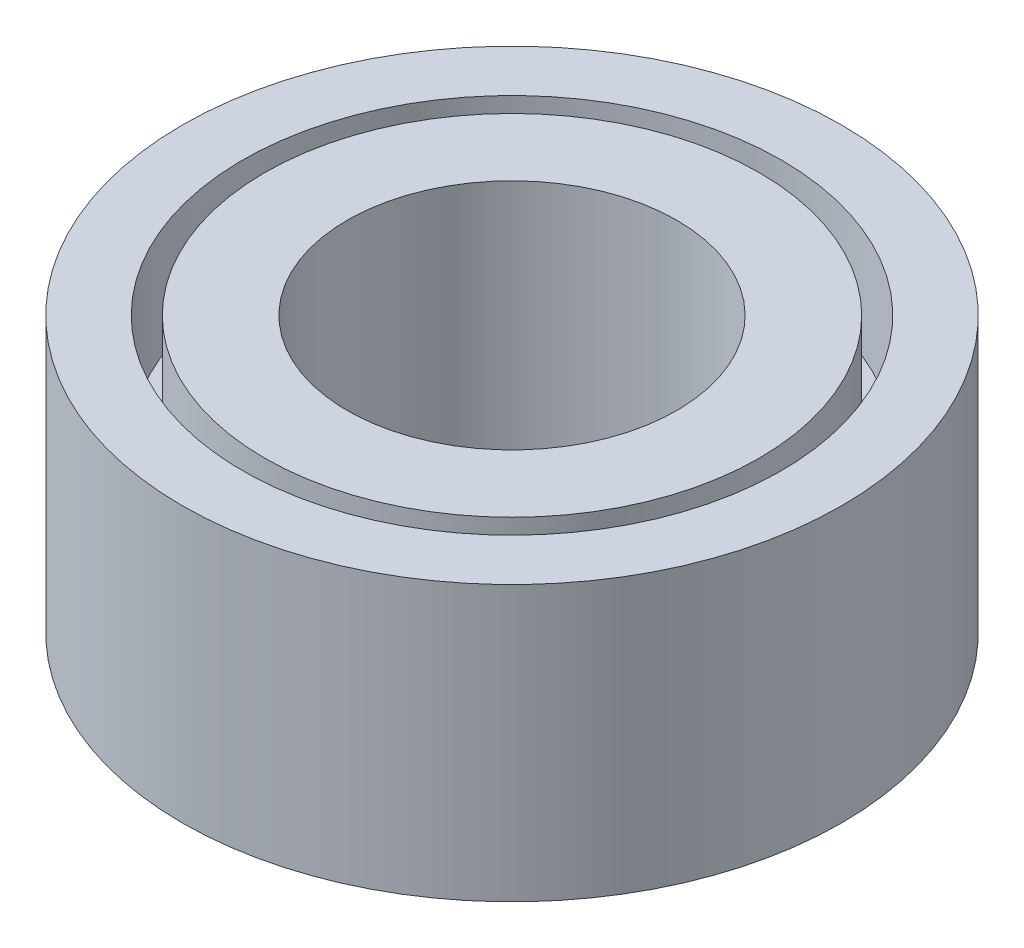
ISO-10303-21;
HEADER;
FILE_DESCRIPTION(('STEP AP214'),'2;1');
FILE_NAME('part.step','',(''),(''),'','','');
FILE_SCHEMA(('AUTOMOTIVE_DESIGN { 1 0 10303 214 1 1 1 1 }'));
ENDSEC;
DATA;
#1=APPLICATION_CONTEXT('core data for automotive mechanical design processes');
#2=APPLICATION_PROTOCOL_DEFINITION('international standard','automotive_design',2000,#1);
#3=PRODUCT_CONTEXT('',#1,'mechanical');
#4=PRODUCT('Part','Part','',(#3));
#5=PRODUCT_RELATED_PRODUCT_CATEGORY('part','',(#4));
#6=PRODUCT_DEFINITION_FORMATION('','',#4);
#7=PRODUCT_DEFINITION_CONTEXT('part definition',#1,'design');
#8=PRODUCT_DEFINITION('design','',#6,#7);
#9=PRODUCT_DEFINITION_SHAPE('','',#8);
#10=(LENGTH_UNIT() NAMED_UNIT(*) SI_UNIT(.MILLI.,.METRE.));
#11=(NAMED_UNIT(*) PLANE_ANGLE_UNIT() SI_UNIT($,.RADIAN.));
#12=(NAMED_UNIT(*) SI_UNIT($,.STERADIAN.) SOLID_ANGLE_UNIT());
#13=UNCERTAINTY_MEASURE_WITH_UNIT(LENGTH_MEASURE(1.E-05),#10,'distance_accuracy_value','');
#14=(GEOMETRIC_REPRESENTATION_CONTEXT(3) GLOBAL_UNCERTAINTY_ASSIGNED_CONTEXT((#13)) GLOBAL_UNIT_ASSIGNED_CONTEXT((#10,
#11,#12)) REPRESENTATION_CONTEXT('',''));
#15=CARTESIAN_POINT('',(0.,0.,0.));
#16=DIRECTION('',(0.,0.,1.));
#17=DIRECTION('',(1.,0.,0.));
#18=AXIS2_PLACEMENT_3D('',#15,#16,#17);
#19=CARTESIAN_POINT('',(0.,2.5,0.));
#20=DIRECTION('',(0.,1.,0.));
#21=DIRECTION('',(0.,0.,-1.));
#22=AXIS2_PLACEMENT_3D('',#19,#20,#21);
#23=PLANE('',#22);
#24=CARTESIAN_POINT('',(0.,2.5,0.));
#25=DIRECTION('',(0.,-1.,0.));
#26=DIRECTION('',(0.,0.,-1.));
#27=AXIS2_PLACEMENT_3D('',#24,#25,#26);
#28=CIRCLE('',#27,1.5);
#29=CARTESIAN_POINT('',(0.,2.5,-1.5));
#30=VERTEX_POINT('',#29);
#31=EDGE_CURVE('E46',#30,#30,#28,.T.);
#32=ORIENTED_EDGE('',*,*,#31,.T.);
#33=EDGE_LOOP('',(#32));
#34=FACE_BOUND('',#33,.T.);
#35=CARTESIAN_POINT('',(0.,2.5,0.));
#36=DIRECTION('',(0.,-1.,0.));
#37=DIRECTION('',(0.,0.,-1.));
#38=AXIS2_PLACEMENT_3D('',#35,#36,#37);
#39=CIRCLE('',#38,2.25);
#40=CARTESIAN_POINT('',(0.,2.5,-2.25));
#41=VERTEX_POINT('',#40);
#42=EDGE_CURVE('E72',#41,#41,#39,.T.);
#43=ORIENTED_EDGE('',*,*,#42,.F.);
#44=EDGE_LOOP('',(#43));
#45=FACE_BOUND('',#44,.T.);
#46=ADVANCED_FACE('F35',(#34,#45),#23,.T.);
#47=CARTESIAN_POINT('',(0.,0.,0.));
#48=DIRECTION('',(0.,1.,0.));
#49=DIRECTION('',(0.,0.,-1.));
#50=AXIS2_PLACEMENT_3D('',#47,#48,#49);
#51=PLANE('',#50);
#52=CARTESIAN_POINT('',(0.,0.,0.));
#53=DIRECTION('',(0.,-1.,0.));
#54=DIRECTION('',(0.,0.,-1.));
#55=AXIS2_PLACEMENT_3D('',#52,#53,#54);
#56=CIRCLE('',#55,1.5);
#57=CARTESIAN_POINT('',(0.,0.,-1.5));
#58=VERTEX_POINT('',#57);
#59=EDGE_CURVE('E48',#58,#58,#56,.T.);
#60=ORIENTED_EDGE('',*,*,#59,.F.);
#61=EDGE_LOOP('',(#60));
#62=FACE_BOUND('',#61,.T.);
#63=CARTESIAN_POINT('',(0.,0.,0.));
#64=DIRECTION('',(0.,-1.,0.));
#65=DIRECTION('',(0.,0.,-1.));
#66=AXIS2_PLACEMENT_3D('',#63,#64,#65);
#67=CIRCLE('',#66,2.25);
#68=CARTESIAN_POINT('',(0.,0.,-2.25));
#69=VERTEX_POINT('',#68);
#70=EDGE_CURVE('E60',#69,#69,#67,.T.);
#71=ORIENTED_EDGE('',*,*,#70,.T.);
#72=EDGE_LOOP('',(#71));
#73=FACE_BOUND('',#72,.T.);
#74=ADVANCED_FACE('F88',(#62,#73),#51,.F.);
#75=CARTESIAN_POINT('',(0.,2.5,0.));
#76=DIRECTION('',(0.,-1.,0.));
#77=DIRECTION('',(0.,0.,-1.));
#78=AXIS2_PLACEMENT_3D('',#75,#76,#77);
#79=CIRCLE('',#78,2.45);
#80=CARTESIAN_POINT('',(0.,2.5,-2.45));
#81=VERTEX_POINT('',#80);
#82=EDGE_CURVE('E66',#81,#81,#79,.T.);
#83=ORIENTED_EDGE('',*,*,#82,.T.);
#84=EDGE_LOOP('',(#83));
#85=FACE_BOUND('',#84,.T.);
#86=CARTESIAN_POINT('',(0.,2.5,0.));
#87=DIRECTION('',(0.,-1.,0.));
#88=DIRECTION('',(0.,0.,-1.));
#89=AXIS2_PLACEMENT_3D('',#86,#87,#88);
#90=CIRCLE('',#89,3.);
#91=CARTESIAN_POINT('',(0.,2.5,-3.));
#92=VERTEX_POINT('',#91);
#93=EDGE_CURVE('E10',#92,#92,#90,.T.);
#94=ORIENTED_EDGE('',*,*,#93,.F.);
#95=EDGE_LOOP('',(#94));
#96=FACE_BOUND('',#95,.T.);
#97=ADVANCED_FACE('F91',(#85,#96),#23,.T.);
#98=CARTESIAN_POINT('',(0.,0.,0.));
#99=DIRECTION('',(0.,-1.,0.));
#100=DIRECTION('',(1.,0.,0.));
#101=AXIS2_PLACEMENT_3D('',#98,#99,#100);
#102=CIRCLE('',#101,2.45);
#103=CARTESIAN_POINT('',(2.45,0.,0.));
#104=VERTEX_POINT('',#103);
#105=EDGE_CURVE('E54',#104,#104,#102,.T.);
#106=ORIENTED_EDGE('',*,*,#105,.F.);
#107=EDGE_LOOP('',(#106));
#108=FACE_BOUND('',#107,.T.);
#109=CARTESIAN_POINT('',(0.,0.,0.));
#110=DIRECTION('',(0.,-1.,0.));
#111=DIRECTION('',(0.,0.,-1.));
#112=AXIS2_PLACEMENT_3D('',#109,#110,#111);
#113=CIRCLE('',#112,3.);
#114=CARTESIAN_POINT('',(0.,0.,-3.));
#115=VERTEX_POINT('',#114);
#116=EDGE_CURVE('E39',#115,#115,#113,.T.);
#117=ORIENTED_EDGE('',*,*,#116,.T.);
#118=EDGE_LOOP('',(#117));
#119=FACE_BOUND('',#118,.T.);
#120=ADVANCED_FACE('F96',(#108,#119),#51,.F.);
#121=CARTESIAN_POINT('',(0.,2.5,0.));
#122=DIRECTION('',(0.,-1.,0.));
#123=DIRECTION('',(0.,0.,1.));
#124=AXIS2_PLACEMENT_3D('',#121,#122,#123);
#125=CYLINDRICAL_SURFACE('',#124,3.);
#126=ORIENTED_EDGE('',*,*,#93,.T.);
#127=EDGE_LOOP('',(#126));
#128=FACE_BOUND('',#127,.T.);
#129=ORIENTED_EDGE('',*,*,#116,.F.);
#130=EDGE_LOOP('',(#129));
#131=FACE_BOUND('',#130,.T.);
#132=ADVANCED_FACE('F37',(#128,#131),#125,.T.);
#133=CARTESIAN_POINT('',(0.,2.5,0.));
#134=DIRECTION('',(0.,-1.,0.));
#135=DIRECTION('',(0.,0.,1.));
#136=AXIS2_PLACEMENT_3D('',#133,#134,#135);
#137=CYLINDRICAL_SURFACE('',#136,1.5);
#138=ORIENTED_EDGE('',*,*,#31,.F.);
#139=EDGE_LOOP('',(#138));
#140=FACE_BOUND('',#139,.T.);
#141=ORIENTED_EDGE('',*,*,#59,.T.);
#142=EDGE_LOOP('',(#141));
#143=FACE_BOUND('',#142,.T.);
#144=ADVANCED_FACE('F124',(#140,#143),#137,.F.);
#145=CARTESIAN_POINT('',(0.,1.,0.));
#146=DIRECTION('',(0.,1.,0.));
#147=DIRECTION('',(0.,0.,-1.));
#148=AXIS2_PLACEMENT_3D('',#145,#146,#147);
#149=PLANE('',#148);
#150=CARTESIAN_POINT('',(0.,1.,0.));
#151=DIRECTION('',(0.,-1.,0.));
#152=DIRECTION('',(1.,0.,0.));
#153=AXIS2_PLACEMENT_3D('',#150,#151,#152);
#154=CIRCLE('',#153,2.45);
#155=CARTESIAN_POINT('',(2.45,1.,0.));
#156=VERTEX_POINT('',#155);
#157=EDGE_CURVE('E51',#156,#156,#154,.T.);
#158=ORIENTED_EDGE('',*,*,#157,.T.);
#159=EDGE_LOOP('',(#158));
#160=FACE_BOUND('',#159,.T.);
#161=CARTESIAN_POINT('',(0.,1.,0.));
#162=DIRECTION('',(0.,-1.,0.));
#163=DIRECTION('',(0.,0.,-1.));
#164=AXIS2_PLACEMENT_3D('',#161,#162,#163);
#165=CIRCLE('',#164,2.25);
#166=CARTESIAN_POINT('',(0.,1.,-2.25));
#167=VERTEX_POINT('',#166);
#168=EDGE_CURVE('E57',#167,#167,#165,.T.);
#169=ORIENTED_EDGE('',*,*,#168,.F.);
#170=EDGE_LOOP('',(#169));
#171=FACE_BOUND('',#170,.T.);
#172=ADVANCED_FACE('F121',(#160,#171),#149,.F.);
#173=CARTESIAN_POINT('',(0.,1.,0.));
#174=DIRECTION('',(0.,-1.,0.));
#175=DIRECTION('',(0.,0.,1.));
#176=AXIS2_PLACEMENT_3D('',#173,#174,#175);
#177=CYLINDRICAL_SURFACE('',#176,2.45);
#178=ORIENTED_EDGE('',*,*,#157,.F.);
#179=EDGE_LOOP('',(#178));
#180=FACE_BOUND('',#179,.T.);
#181=ORIENTED_EDGE('',*,*,#105,.T.);
#182=EDGE_LOOP('',(#181));
#183=FACE_BOUND('',#182,.T.);
#184=ADVANCED_FACE('F117',(#180,#183),#177,.F.);
#185=CARTESIAN_POINT('',(0.,1.,0.));
#186=DIRECTION('',(0.,-1.,0.));
#187=DIRECTION('',(0.,0.,1.));
#188=AXIS2_PLACEMENT_3D('',#185,#186,#187);
#189=CYLINDRICAL_SURFACE('',#188,2.25);
#190=ORIENTED_EDGE('',*,*,#168,.T.);
#191=EDGE_LOOP('',(#190));
#192=FACE_BOUND('',#191,.T.);
#193=ORIENTED_EDGE('',*,*,#70,.F.);
#194=EDGE_LOOP('',(#193));
#195=FACE_BOUND('',#194,.T.);
#196=ADVANCED_FACE('F109',(#192,#195),#189,.T.);
#197=CARTESIAN_POINT('',(0.,1.5,0.));
#198=DIRECTION('',(0.,1.,0.));
#199=DIRECTION('',(0.,0.,-1.));
#200=AXIS2_PLACEMENT_3D('',#197,#198,#199);
#201=CYLINDRICAL_SURFACE('',#200,2.45);
#202=CARTESIAN_POINT('',(0.,1.5,0.));
#203=DIRECTION('',(0.,-1.,0.));
#204=DIRECTION('',(0.,0.,-1.));
#205=AXIS2_PLACEMENT_3D('',#202,#203,#204);
#206=CIRCLE('',#205,2.45);
#207=CARTESIAN_POINT('',(0.,1.5,-2.45));
#208=VERTEX_POINT('',#207);
#209=EDGE_CURVE('E63',#208,#208,#206,.T.);
#210=ORIENTED_EDGE('',*,*,#209,.T.);
#211=EDGE_LOOP('',(#210));
#212=FACE_BOUND('',#211,.T.);
#213=ORIENTED_EDGE('',*,*,#82,.F.);
#214=EDGE_LOOP('',(#213));
#215=FACE_BOUND('',#214,.T.);
#216=ADVANCED_FACE('F107',(#212,#215),#201,.F.);
#217=CARTESIAN_POINT('',(0.,1.5,0.));
#218=DIRECTION('',(0.,1.,0.));
#219=DIRECTION('',(0.,0.,-1.));
#220=AXIS2_PLACEMENT_3D('',#217,#218,#219);
#221=PLANE('',#220);
#222=CARTESIAN_POINT('',(0.,1.5,0.));
#223=DIRECTION('',(0.,-1.,0.));
#224=DIRECTION('',(0.,0.,-1.));
#225=AXIS2_PLACEMENT_3D('',#222,#223,#224);
#226=CIRCLE('',#225,2.25);
#227=CARTESIAN_POINT('',(0.,1.5,-2.25));
#228=VERTEX_POINT('',#227);
#229=EDGE_CURVE('E69',#228,#228,#226,.T.);
#230=ORIENTED_EDGE('',*,*,#229,.T.);
#231=EDGE_LOOP('',(#230));
#232=FACE_BOUND('',#231,.T.);
#233=ORIENTED_EDGE('',*,*,#209,.F.);
#234=EDGE_LOOP('',(#233));
#235=FACE_BOUND('',#234,.T.);
#236=ADVANCED_FACE('F78',(#232,#235),#221,.T.);
#237=CARTESIAN_POINT('',(0.,1.5,0.));
#238=DIRECTION('',(0.,1.,0.));
#239=DIRECTION('',(0.,0.,-1.));
#240=AXIS2_PLACEMENT_3D('',#237,#238,#239);
#241=CYLINDRICAL_SURFACE('',#240,2.25);
#242=ORIENTED_EDGE('',*,*,#229,.F.);
#243=EDGE_LOOP('',(#242));
#244=FACE_BOUND('',#243,.T.);
#245=ORIENTED_EDGE('',*,*,#42,.T.);
#246=EDGE_LOOP('',(#245));
#247=FACE_BOUND('',#246,.T.);
#248=ADVANCED_FACE('F81',(#244,#247),#241,.T.);
#249=CLOSED_SHELL('',(#46,#74,#97,#120,#132,#144,#172,#184,#196,#216,#236,#248));
#250=MANIFOLD_SOLID_BREP('B2',#249);
#251=ADVANCED_BREP_SHAPE_REPRESENTATION('',(#18,#250),#14);
#252=SHAPE_DEFINITION_REPRESENTATION(#9,#251);
ENDSEC;
END-ISO-10303-21;
